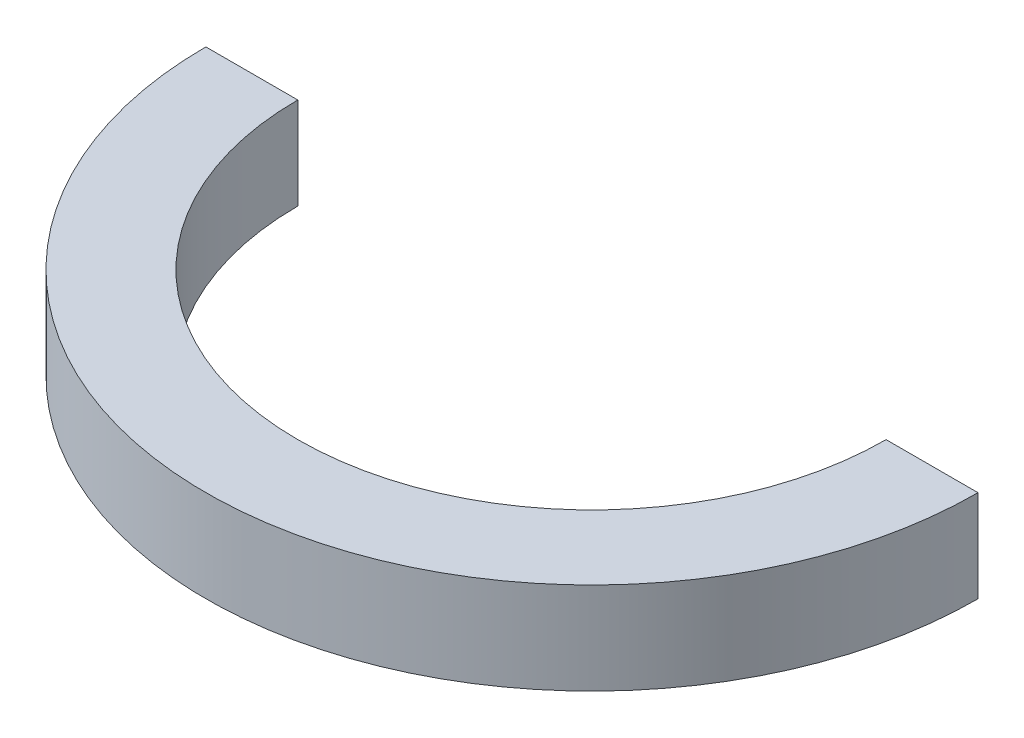
ISO-10303-21;
HEADER;
FILE_DESCRIPTION(('STEP AP214'),'2;1');
FILE_NAME('part.step','',(''),(''),'','','');
FILE_SCHEMA(('AUTOMOTIVE_DESIGN { 1 0 10303 214 1 1 1 1 }'));
ENDSEC;
DATA;
#1=APPLICATION_CONTEXT('core data for automotive mechanical design processes');
#2=APPLICATION_PROTOCOL_DEFINITION('international standard','automotive_design',2000,#1);
#3=PRODUCT_CONTEXT('',#1,'mechanical');
#4=PRODUCT('Part','Part','',(#3));
#5=PRODUCT_RELATED_PRODUCT_CATEGORY('part','',(#4));
#6=PRODUCT_DEFINITION_FORMATION('','',#4);
#7=PRODUCT_DEFINITION_CONTEXT('part definition',#1,'design');
#8=PRODUCT_DEFINITION('design','',#6,#7);
#9=PRODUCT_DEFINITION_SHAPE('','',#8);
#10=(LENGTH_UNIT() NAMED_UNIT(*) SI_UNIT(.MILLI.,.METRE.));
#11=(NAMED_UNIT(*) PLANE_ANGLE_UNIT() SI_UNIT($,.RADIAN.));
#12=(NAMED_UNIT(*) SI_UNIT($,.STERADIAN.) SOLID_ANGLE_UNIT());
#13=UNCERTAINTY_MEASURE_WITH_UNIT(LENGTH_MEASURE(1.E-05),#10,'distance_accuracy_value','');
#14=(GEOMETRIC_REPRESENTATION_CONTEXT(3) GLOBAL_UNCERTAINTY_ASSIGNED_CONTEXT((#13)) GLOBAL_UNIT_ASSIGNED_CONTEXT((#10,
#11,#12)) REPRESENTATION_CONTEXT('',''));
#15=CARTESIAN_POINT('',(0.,0.,0.));
#16=DIRECTION('',(0.,0.,1.));
#17=DIRECTION('',(1.,0.,0.));
#18=AXIS2_PLACEMENT_3D('',#15,#16,#17);
#19=CARTESIAN_POINT('',(0.,10.,0.));
#20=DIRECTION('',(0.,-1.,0.));
#21=DIRECTION('',(0.,0.,-1.));
#22=AXIS2_PLACEMENT_3D('',#19,#20,#21);
#23=CYLINDRICAL_SURFACE('',#22,42.);
#24=CARTESIAN_POINT('',(0.,0.,0.));
#25=DIRECTION('',(0.,1.,0.));
#26=DIRECTION('',(1.,0.,0.));
#27=AXIS2_PLACEMENT_3D('',#24,#25,#26);
#28=CIRCLE('',#27,42.);
#29=CARTESIAN_POINT('',(-42.,0.,0.));
#30=VERTEX_POINT('',#29);
#31=CARTESIAN_POINT('',(42.,0.,0.));
#32=VERTEX_POINT('',#31);
#33=EDGE_CURVE('E111',#30,#32,#28,.T.);
#34=ORIENTED_EDGE('',*,*,#33,.T.);
#35=DIRECTION('',(0.,-1.,0.));
#36=VECTOR('',#35,1.);
#37=CARTESIAN_POINT('',(42.,10.,0.));
#38=LINE('',#37,#36);
#39=CARTESIAN_POINT('',(42.,10.,0.));
#40=VERTEX_POINT('',#39);
#41=EDGE_CURVE('E11',#40,#32,#38,.T.);
#42=ORIENTED_EDGE('',*,*,#41,.F.);
#43=CARTESIAN_POINT('',(0.,10.,0.));
#44=DIRECTION('',(0.,1.,0.));
#45=DIRECTION('',(1.,0.,0.));
#46=AXIS2_PLACEMENT_3D('',#43,#44,#45);
#47=CIRCLE('',#46,42.);
#48=CARTESIAN_POINT('',(-42.,10.,0.));
#49=VERTEX_POINT('',#48);
#50=EDGE_CURVE('E84',#49,#40,#47,.T.);
#51=ORIENTED_EDGE('',*,*,#50,.F.);
#52=DIRECTION('',(0.,-1.,0.));
#53=VECTOR('',#52,1.);
#54=CARTESIAN_POINT('',(-42.,10.,0.));
#55=LINE('',#54,#53);
#56=EDGE_CURVE('E60',#49,#30,#55,.T.);
#57=ORIENTED_EDGE('',*,*,#56,.T.);
#58=EDGE_LOOP('',(#34,#42,#51,#57));
#59=FACE_BOUND('',#58,.T.);
#60=ADVANCED_FACE('F43',(#59),#23,.T.);
#61=CARTESIAN_POINT('',(32.,10.,0.));
#62=DIRECTION('',(0.,0.,-1.));
#63=DIRECTION('',(-1.,0.,0.));
#64=AXIS2_PLACEMENT_3D('',#61,#62,#63);
#65=PLANE('',#64);
#66=DIRECTION('',(1.,0.,0.));
#67=VECTOR('',#66,1.);
#68=CARTESIAN_POINT('',(32.,0.,0.));
#69=LINE('',#68,#67);
#70=CARTESIAN_POINT('',(32.,0.,0.));
#71=VERTEX_POINT('',#70);
#72=EDGE_CURVE('E93',#71,#32,#69,.T.);
#73=ORIENTED_EDGE('',*,*,#72,.F.);
#74=DIRECTION('',(0.,-1.,0.));
#75=VECTOR('',#74,1.);
#76=CARTESIAN_POINT('',(32.,10.,0.));
#77=LINE('',#76,#75);
#78=CARTESIAN_POINT('',(32.,10.,0.));
#79=VERTEX_POINT('',#78);
#80=EDGE_CURVE('E52',#79,#71,#77,.T.);
#81=ORIENTED_EDGE('',*,*,#80,.F.);
#82=DIRECTION('',(1.,0.,0.));
#83=VECTOR('',#82,1.);
#84=CARTESIAN_POINT('',(32.,10.,0.));
#85=LINE('',#84,#83);
#86=EDGE_CURVE('E91',#79,#40,#85,.T.);
#87=ORIENTED_EDGE('',*,*,#86,.T.);
#88=ORIENTED_EDGE('',*,*,#41,.T.);
#89=EDGE_LOOP('',(#73,#81,#87,#88));
#90=FACE_BOUND('',#89,.T.);
#91=ADVANCED_FACE('F90',(#90),#65,.T.);
#92=CARTESIAN_POINT('',(0.,10.,0.));
#93=DIRECTION('',(0.,-1.,0.));
#94=DIRECTION('',(0.,0.,-1.));
#95=AXIS2_PLACEMENT_3D('',#92,#93,#94);
#96=CYLINDRICAL_SURFACE('',#95,32.);
#97=CARTESIAN_POINT('',(0.,0.,0.));
#98=DIRECTION('',(0.,1.,0.));
#99=DIRECTION('',(0.,0.,1.));
#100=AXIS2_PLACEMENT_3D('',#97,#98,#99);
#101=CIRCLE('',#100,32.);
#102=CARTESIAN_POINT('',(-32.,0.,0.));
#103=VERTEX_POINT('',#102);
#104=EDGE_CURVE('E116',#103,#71,#101,.T.);
#105=ORIENTED_EDGE('',*,*,#104,.F.);
#106=DIRECTION('',(0.,-1.,0.));
#107=VECTOR('',#106,1.);
#108=CARTESIAN_POINT('',(-32.,10.,0.));
#109=LINE('',#108,#107);
#110=CARTESIAN_POINT('',(-32.,10.,0.));
#111=VERTEX_POINT('',#110);
#112=EDGE_CURVE('E73',#111,#103,#109,.T.);
#113=ORIENTED_EDGE('',*,*,#112,.F.);
#114=CARTESIAN_POINT('',(0.,10.,0.));
#115=DIRECTION('',(0.,1.,0.));
#116=DIRECTION('',(0.,0.,1.));
#117=AXIS2_PLACEMENT_3D('',#114,#115,#116);
#118=CIRCLE('',#117,32.);
#119=EDGE_CURVE('E100',#111,#79,#118,.T.);
#120=ORIENTED_EDGE('',*,*,#119,.T.);
#121=ORIENTED_EDGE('',*,*,#80,.T.);
#122=EDGE_LOOP('',(#105,#113,#120,#121));
#123=FACE_BOUND('',#122,.T.);
#124=ADVANCED_FACE('F103',(#123),#96,.F.);
#125=CARTESIAN_POINT('',(-42.,10.,0.));
#126=DIRECTION('',(0.,0.,-1.));
#127=DIRECTION('',(-1.,0.,0.));
#128=AXIS2_PLACEMENT_3D('',#125,#126,#127);
#129=PLANE('',#128);
#130=DIRECTION('',(1.,0.,0.));
#131=VECTOR('',#130,1.);
#132=CARTESIAN_POINT('',(-42.,0.,0.));
#133=LINE('',#132,#131);
#134=EDGE_CURVE('E119',#30,#103,#133,.T.);
#135=ORIENTED_EDGE('',*,*,#134,.F.);
#136=ORIENTED_EDGE('',*,*,#56,.F.);
#137=DIRECTION('',(1.,0.,0.));
#138=VECTOR('',#137,1.);
#139=CARTESIAN_POINT('',(-42.,10.,0.));
#140=LINE('',#139,#138);
#141=EDGE_CURVE('E105',#49,#111,#140,.T.);
#142=ORIENTED_EDGE('',*,*,#141,.T.);
#143=ORIENTED_EDGE('',*,*,#112,.T.);
#144=EDGE_LOOP('',(#135,#136,#142,#143));
#145=FACE_BOUND('',#144,.T.);
#146=ADVANCED_FACE('F129',(#145),#129,.T.);
#147=CARTESIAN_POINT('',(0.,10.,0.));
#148=DIRECTION('',(0.,1.,0.));
#149=DIRECTION('',(1.,0.,0.));
#150=AXIS2_PLACEMENT_3D('',#147,#148,#149);
#151=PLANE('',#150);
#152=ORIENTED_EDGE('',*,*,#50,.T.);
#153=ORIENTED_EDGE('',*,*,#86,.F.);
#154=ORIENTED_EDGE('',*,*,#119,.F.);
#155=ORIENTED_EDGE('',*,*,#141,.F.);
#156=EDGE_LOOP('',(#152,#153,#154,#155));
#157=FACE_BOUND('',#156,.T.);
#158=ADVANCED_FACE('F99',(#157),#151,.T.);
#159=CARTESIAN_POINT('',(0.,0.,0.));
#160=DIRECTION('',(0.,1.,0.));
#161=DIRECTION('',(1.,0.,0.));
#162=AXIS2_PLACEMENT_3D('',#159,#160,#161);
#163=PLANE('',#162);
#164=ORIENTED_EDGE('',*,*,#33,.F.);
#165=ORIENTED_EDGE('',*,*,#134,.T.);
#166=ORIENTED_EDGE('',*,*,#104,.T.);
#167=ORIENTED_EDGE('',*,*,#72,.T.);
#168=EDGE_LOOP('',(#164,#165,#166,#167));
#169=FACE_BOUND('',#168,.T.);
#170=ADVANCED_FACE('F128',(#169),#163,.F.);
#171=CLOSED_SHELL('',(#60,#91,#124,#146,#158,#170));
#172=MANIFOLD_SOLID_BREP('B2',#171);
#173=ADVANCED_BREP_SHAPE_REPRESENTATION('',(#18,#172),#14);
#174=SHAPE_DEFINITION_REPRESENTATION(#9,#173);
ENDSEC;
END-ISO-10303-21;
